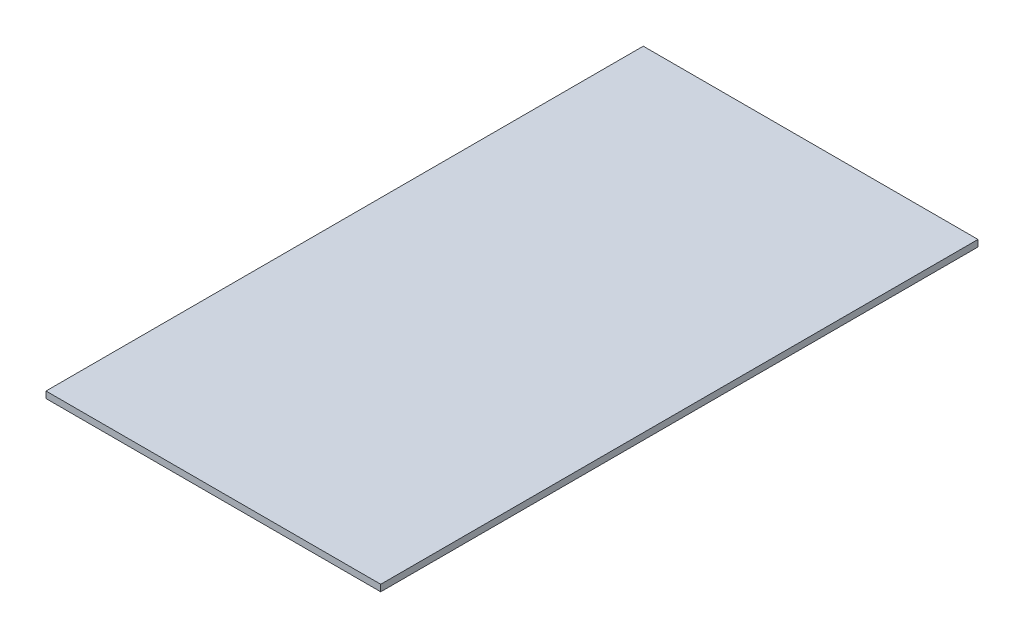
ISO-10303-21;
HEADER;
FILE_DESCRIPTION(('STEP AP214'),'2;1');
FILE_NAME('part.step','',(''),(''),'','','');
FILE_SCHEMA(('AUTOMOTIVE_DESIGN { 1 0 10303 214 1 1 1 1 }'));
ENDSEC;
DATA;
#1=APPLICATION_CONTEXT('core data for automotive mechanical design processes');
#2=APPLICATION_PROTOCOL_DEFINITION('international standard','automotive_design',2000,#1);
#3=PRODUCT_CONTEXT('',#1,'mechanical');
#4=PRODUCT('Part','Part','',(#3));
#5=PRODUCT_RELATED_PRODUCT_CATEGORY('part','',(#4));
#6=PRODUCT_DEFINITION_FORMATION('','',#4);
#7=PRODUCT_DEFINITION_CONTEXT('part definition',#1,'design');
#8=PRODUCT_DEFINITION('design','',#6,#7);
#9=PRODUCT_DEFINITION_SHAPE('','',#8);
#10=(LENGTH_UNIT() NAMED_UNIT(*) SI_UNIT(.MILLI.,.METRE.));
#11=(NAMED_UNIT(*) PLANE_ANGLE_UNIT() SI_UNIT($,.RADIAN.));
#12=(NAMED_UNIT(*) SI_UNIT($,.STERADIAN.) SOLID_ANGLE_UNIT());
#13=UNCERTAINTY_MEASURE_WITH_UNIT(LENGTH_MEASURE(1.E-05),#10,'distance_accuracy_value','');
#14=(GEOMETRIC_REPRESENTATION_CONTEXT(3) GLOBAL_UNCERTAINTY_ASSIGNED_CONTEXT((#13)) GLOBAL_UNIT_ASSIGNED_CONTEXT((#10,
#11,#12)) REPRESENTATION_CONTEXT('',''));
#15=CARTESIAN_POINT('',(0.,0.,0.));
#16=DIRECTION('',(0.,0.,1.));
#17=DIRECTION('',(1.,0.,0.));
#18=AXIS2_PLACEMENT_3D('',#15,#16,#17);
#19=CARTESIAN_POINT('',(-48.1672235764501,380.861864019682,-448.315039757399));
#20=DIRECTION('',(-1.,0.,0.));
#21=DIRECTION('',(0.,-1.,0.));
#22=AXIS2_PLACEMENT_3D('',#19,#20,#21);
#23=PLANE('',#22);
#24=DIRECTION('',(0.,0.,1.));
#25=VECTOR('',#24,1.);
#26=CARTESIAN_POINT('',(-48.1672235764501,385.861864019682,-448.315039757399));
#27=LINE('',#26,#25);
#28=CARTESIAN_POINT('',(-48.1672235764501,385.861864019682,-448.315039757399));
#29=VERTEX_POINT('',#28);
#30=CARTESIAN_POINT('',(-48.1672235764501,385.861864019682,6.68496024260085));
#31=VERTEX_POINT('',#30);
#32=EDGE_CURVE('E104',#29,#31,#27,.T.);
#33=ORIENTED_EDGE('',*,*,#32,.F.);
#34=DIRECTION('',(0.,1.,0.));
#35=VECTOR('',#34,1.);
#36=CARTESIAN_POINT('',(-48.1672235764501,380.861864019682,-448.315039757399));
#37=LINE('',#36,#35);
#38=CARTESIAN_POINT('',(-48.1672235764501,380.861864019682,-448.315039757399));
#39=VERTEX_POINT('',#38);
#40=EDGE_CURVE('E11',#39,#29,#37,.T.);
#41=ORIENTED_EDGE('',*,*,#40,.F.);
#42=DIRECTION('',(0.,0.,1.));
#43=VECTOR('',#42,1.);
#44=CARTESIAN_POINT('',(-48.1672235764501,380.861864019682,-448.315039757399));
#45=LINE('',#44,#43);
#46=CARTESIAN_POINT('',(-48.1672235764501,380.861864019682,6.68496024260085));
#47=VERTEX_POINT('',#46);
#48=EDGE_CURVE('E98',#39,#47,#45,.T.);
#49=ORIENTED_EDGE('',*,*,#48,.T.);
#50=DIRECTION('',(0.,1.,0.));
#51=VECTOR('',#50,1.);
#52=CARTESIAN_POINT('',(-48.1672235764501,380.861864019682,6.68496024260085));
#53=LINE('',#52,#51);
#54=EDGE_CURVE('E43',#47,#31,#53,.T.);
#55=ORIENTED_EDGE('',*,*,#54,.T.);
#56=EDGE_LOOP('',(#33,#41,#49,#55));
#57=FACE_BOUND('',#56,.T.);
#58=ADVANCED_FACE('F40',(#57),#23,.T.);
#59=CARTESIAN_POINT('',(206.83277642355,380.861864019682,-448.315039757399));
#60=DIRECTION('',(0.,0.,-1.));
#61=DIRECTION('',(-1.,0.,0.));
#62=AXIS2_PLACEMENT_3D('',#59,#60,#61);
#63=PLANE('',#62);
#64=DIRECTION('',(-1.,0.,0.));
#65=VECTOR('',#64,1.);
#66=CARTESIAN_POINT('',(206.83277642355,385.861864019682,-448.315039757399));
#67=LINE('',#66,#65);
#68=CARTESIAN_POINT('',(206.83277642355,385.861864019682,-448.315039757399));
#69=VERTEX_POINT('',#68);
#70=EDGE_CURVE('E100',#69,#29,#67,.T.);
#71=ORIENTED_EDGE('',*,*,#70,.F.);
#72=DIRECTION('',(0.,1.,0.));
#73=VECTOR('',#72,1.);
#74=CARTESIAN_POINT('',(206.83277642355,380.861864019682,-448.315039757399));
#75=LINE('',#74,#73);
#76=CARTESIAN_POINT('',(206.83277642355,380.861864019682,-448.315039757399));
#77=VERTEX_POINT('',#76);
#78=EDGE_CURVE('E49',#77,#69,#75,.T.);
#79=ORIENTED_EDGE('',*,*,#78,.F.);
#80=DIRECTION('',(-1.,0.,0.));
#81=VECTOR('',#80,1.);
#82=CARTESIAN_POINT('',(206.83277642355,380.861864019682,-448.315039757399));
#83=LINE('',#82,#81);
#84=EDGE_CURVE('E95',#77,#39,#83,.T.);
#85=ORIENTED_EDGE('',*,*,#84,.T.);
#86=ORIENTED_EDGE('',*,*,#40,.T.);
#87=EDGE_LOOP('',(#71,#79,#85,#86));
#88=FACE_BOUND('',#87,.T.);
#89=ADVANCED_FACE('F114',(#88),#63,.T.);
#90=CARTESIAN_POINT('',(206.83277642355,380.861864019682,6.68496024260085));
#91=DIRECTION('',(1.,0.,0.));
#92=DIRECTION('',(0.,0.,-1.));
#93=AXIS2_PLACEMENT_3D('',#90,#91,#92);
#94=PLANE('',#93);
#95=DIRECTION('',(0.,0.,-1.));
#96=VECTOR('',#95,1.);
#97=CARTESIAN_POINT('',(206.83277642355,385.861864019682,6.68496024260085));
#98=LINE('',#97,#96);
#99=CARTESIAN_POINT('',(206.83277642355,385.861864019682,6.68496024260085));
#100=VERTEX_POINT('',#99);
#101=EDGE_CURVE('E90',#100,#69,#98,.T.);
#102=ORIENTED_EDGE('',*,*,#101,.F.);
#103=DIRECTION('',(0.,1.,0.));
#104=VECTOR('',#103,1.);
#105=CARTESIAN_POINT('',(206.83277642355,380.861864019682,6.68496024260085));
#106=LINE('',#105,#104);
#107=CARTESIAN_POINT('',(206.83277642355,380.861864019682,6.68496024260085));
#108=VERTEX_POINT('',#107);
#109=EDGE_CURVE('E85',#108,#100,#106,.T.);
#110=ORIENTED_EDGE('',*,*,#109,.F.);
#111=DIRECTION('',(0.,0.,-1.));
#112=VECTOR('',#111,1.);
#113=CARTESIAN_POINT('',(206.83277642355,380.861864019682,6.68496024260085));
#114=LINE('',#113,#112);
#115=EDGE_CURVE('E88',#108,#77,#114,.T.);
#116=ORIENTED_EDGE('',*,*,#115,.T.);
#117=ORIENTED_EDGE('',*,*,#78,.T.);
#118=EDGE_LOOP('',(#102,#110,#116,#117));
#119=FACE_BOUND('',#118,.T.);
#120=ADVANCED_FACE('F87',(#119),#94,.T.);
#121=CARTESIAN_POINT('',(-48.1672235764501,380.861864019682,6.68496024260085));
#122=DIRECTION('',(0.,0.,1.));
#123=DIRECTION('',(0.,-1.,0.));
#124=AXIS2_PLACEMENT_3D('',#121,#122,#123);
#125=PLANE('',#124);
#126=DIRECTION('',(1.,0.,0.));
#127=VECTOR('',#126,1.);
#128=CARTESIAN_POINT('',(-48.1672235764501,385.861864019682,6.68496024260085));
#129=LINE('',#128,#127);
#130=EDGE_CURVE('E107',#31,#100,#129,.T.);
#131=ORIENTED_EDGE('',*,*,#130,.F.);
#132=ORIENTED_EDGE('',*,*,#54,.F.);
#133=DIRECTION('',(1.,0.,0.));
#134=VECTOR('',#133,1.);
#135=CARTESIAN_POINT('',(-48.1672235764501,380.861864019682,6.68496024260085));
#136=LINE('',#135,#134);
#137=EDGE_CURVE('E94',#47,#108,#136,.T.);
#138=ORIENTED_EDGE('',*,*,#137,.T.);
#139=ORIENTED_EDGE('',*,*,#109,.T.);
#140=EDGE_LOOP('',(#131,#132,#138,#139));
#141=FACE_BOUND('',#140,.T.);
#142=ADVANCED_FACE('F97',(#141),#125,.T.);
#143=CARTESIAN_POINT('',(0.,380.861864019682,0.));
#144=DIRECTION('',(0.,1.,0.));
#145=DIRECTION('',(0.,0.,1.));
#146=AXIS2_PLACEMENT_3D('',#143,#144,#145);
#147=PLANE('',#146);
#148=ORIENTED_EDGE('',*,*,#48,.F.);
#149=ORIENTED_EDGE('',*,*,#84,.F.);
#150=ORIENTED_EDGE('',*,*,#115,.F.);
#151=ORIENTED_EDGE('',*,*,#137,.F.);
#152=EDGE_LOOP('',(#148,#149,#150,#151));
#153=FACE_BOUND('',#152,.T.);
#154=ADVANCED_FACE('F93',(#153),#147,.F.);
#155=CARTESIAN_POINT('',(0.,385.861864019682,0.));
#156=DIRECTION('',(0.,1.,0.));
#157=DIRECTION('',(0.,0.,1.));
#158=AXIS2_PLACEMENT_3D('',#155,#156,#157);
#159=PLANE('',#158);
#160=ORIENTED_EDGE('',*,*,#32,.T.);
#161=ORIENTED_EDGE('',*,*,#130,.T.);
#162=ORIENTED_EDGE('',*,*,#101,.T.);
#163=ORIENTED_EDGE('',*,*,#70,.T.);
#164=EDGE_LOOP('',(#160,#161,#162,#163));
#165=FACE_BOUND('',#164,.T.);
#166=ADVANCED_FACE('F113',(#165),#159,.T.);
#167=CLOSED_SHELL('',(#58,#89,#120,#142,#154,#166));
#168=MANIFOLD_SOLID_BREP('B2',#167);
#169=ADVANCED_BREP_SHAPE_REPRESENTATION('',(#18,#168),#14);
#170=SHAPE_DEFINITION_REPRESENTATION(#9,#169);
ENDSEC;
END-ISO-10303-21;
